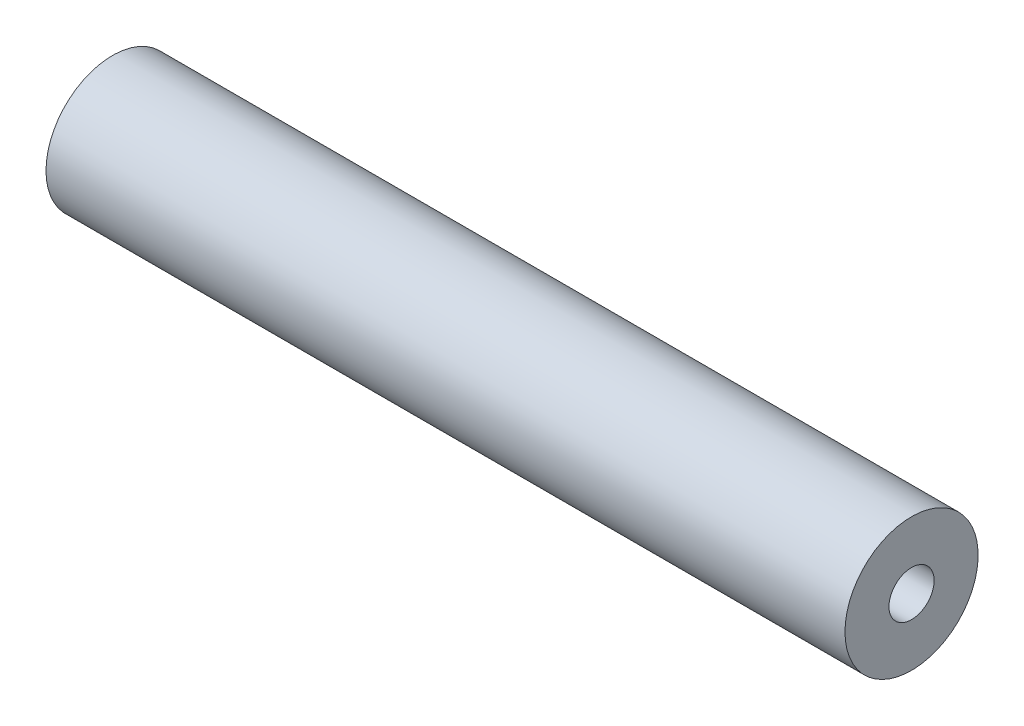
ISO-10303-21;
HEADER;
FILE_DESCRIPTION(('STEP AP214'),'2;1');
FILE_NAME('part.step','',(''),(''),'','','');
FILE_SCHEMA(('AUTOMOTIVE_DESIGN { 1 0 10303 214 1 1 1 1 }'));
ENDSEC;
DATA;
#1=APPLICATION_CONTEXT('core data for automotive mechanical design processes');
#2=APPLICATION_PROTOCOL_DEFINITION('international standard','automotive_design',2000,#1);
#3=PRODUCT_CONTEXT('',#1,'mechanical');
#4=PRODUCT('Part','Part','',(#3));
#5=PRODUCT_RELATED_PRODUCT_CATEGORY('part','',(#4));
#6=PRODUCT_DEFINITION_FORMATION('','',#4);
#7=PRODUCT_DEFINITION_CONTEXT('part definition',#1,'design');
#8=PRODUCT_DEFINITION('design','',#6,#7);
#9=PRODUCT_DEFINITION_SHAPE('','',#8);
#10=(LENGTH_UNIT() NAMED_UNIT(*) SI_UNIT(.MILLI.,.METRE.));
#11=(NAMED_UNIT(*) PLANE_ANGLE_UNIT() SI_UNIT($,.RADIAN.));
#12=(NAMED_UNIT(*) SI_UNIT($,.STERADIAN.) SOLID_ANGLE_UNIT());
#13=UNCERTAINTY_MEASURE_WITH_UNIT(LENGTH_MEASURE(1.E-05),#10,'distance_accuracy_value','');
#14=(GEOMETRIC_REPRESENTATION_CONTEXT(3) GLOBAL_UNCERTAINTY_ASSIGNED_CONTEXT((#13)) GLOBAL_UNIT_ASSIGNED_CONTEXT((#10,
#11,#12)) REPRESENTATION_CONTEXT('',''));
#15=CARTESIAN_POINT('',(0.,0.,0.));
#16=DIRECTION('',(0.,0.,1.));
#17=DIRECTION('',(1.,0.,0.));
#18=AXIS2_PLACEMENT_3D('',#15,#16,#17);
#19=CARTESIAN_POINT('',(76.2,0.,0.));
#20=DIRECTION('',(1.,0.,0.));
#21=DIRECTION('',(0.,0.,-1.));
#22=AXIS2_PLACEMENT_3D('',#19,#20,#21);
#23=PLANE('',#22);
#24=CARTESIAN_POINT('',(76.2,0.,0.));
#25=DIRECTION('',(1.,0.,0.));
#26=DIRECTION('',(0.,0.,-1.));
#27=AXIS2_PLACEMENT_3D('',#24,#25,#26);
#28=CIRCLE('',#27,6.35);
#29=CARTESIAN_POINT('',(76.2,0.,6.35));
#30=VERTEX_POINT('',#29);
#31=EDGE_CURVE('E10',#30,#30,#28,.T.);
#32=ORIENTED_EDGE('',*,*,#31,.T.);
#33=EDGE_LOOP('',(#32));
#34=FACE_BOUND('',#33,.T.);
#35=CARTESIAN_POINT('',(76.2,0.,0.));
#36=DIRECTION('',(1.,0.,0.));
#37=DIRECTION('',(0.,0.,-1.));
#38=AXIS2_PLACEMENT_3D('',#35,#36,#37);
#39=CIRCLE('',#38,2.15265);
#40=CARTESIAN_POINT('',(76.2,0.,2.15265));
#41=VERTEX_POINT('',#40);
#42=EDGE_CURVE('E42',#41,#41,#39,.T.);
#43=ORIENTED_EDGE('',*,*,#42,.F.);
#44=EDGE_LOOP('',(#43));
#45=FACE_BOUND('',#44,.T.);
#46=ADVANCED_FACE('F31',(#34,#45),#23,.T.);
#47=CARTESIAN_POINT('',(0.,0.,0.));
#48=DIRECTION('',(1.,0.,0.));
#49=DIRECTION('',(0.,0.,-1.));
#50=AXIS2_PLACEMENT_3D('',#47,#48,#49);
#51=PLANE('',#50);
#52=CARTESIAN_POINT('',(0.,0.,0.));
#53=DIRECTION('',(1.,0.,0.));
#54=DIRECTION('',(0.,0.,-1.));
#55=AXIS2_PLACEMENT_3D('',#52,#53,#54);
#56=CIRCLE('',#55,6.35);
#57=CARTESIAN_POINT('',(0.,0.,6.35));
#58=VERTEX_POINT('',#57);
#59=EDGE_CURVE('E35',#58,#58,#56,.T.);
#60=ORIENTED_EDGE('',*,*,#59,.F.);
#61=EDGE_LOOP('',(#60));
#62=FACE_BOUND('',#61,.T.);
#63=CARTESIAN_POINT('',(0.,0.,0.));
#64=DIRECTION('',(1.,0.,0.));
#65=DIRECTION('',(0.,0.,-1.));
#66=AXIS2_PLACEMENT_3D('',#63,#64,#65);
#67=CIRCLE('',#66,2.15265);
#68=CARTESIAN_POINT('',(0.,0.,2.15265));
#69=VERTEX_POINT('',#68);
#70=EDGE_CURVE('E44',#69,#69,#67,.T.);
#71=ORIENTED_EDGE('',*,*,#70,.T.);
#72=EDGE_LOOP('',(#71));
#73=FACE_BOUND('',#72,.T.);
#74=ADVANCED_FACE('F54',(#62,#73),#51,.F.);
#75=CARTESIAN_POINT('',(76.2,0.,0.));
#76=DIRECTION('',(-1.,0.,0.));
#77=DIRECTION('',(0.,0.,1.));
#78=AXIS2_PLACEMENT_3D('',#75,#76,#77);
#79=CYLINDRICAL_SURFACE('',#78,6.35);
#80=CARTESIAN_POINT('',(76.2,0.,6.35));
#81=CARTESIAN_POINT('',(75.40625,0.,6.35));
#82=CARTESIAN_POINT('',(74.6125,0.,6.35));
#83=CARTESIAN_POINT('',(73.025,0.,6.35));
#84=CARTESIAN_POINT('',(72.23125,0.,6.35));
#85=CARTESIAN_POINT('',(70.64375,0.,6.35));
#86=CARTESIAN_POINT('',(69.85,0.,6.35));
#87=CARTESIAN_POINT('',(68.2625,0.,6.35));
#88=CARTESIAN_POINT('',(67.46875,0.,6.35));
#89=CARTESIAN_POINT('',(65.88125,0.,6.35));
#90=CARTESIAN_POINT('',(65.0875,0.,6.35));
#91=CARTESIAN_POINT('',(63.5,0.,6.35));
#92=CARTESIAN_POINT('',(62.70625,0.,6.35));
#93=CARTESIAN_POINT('',(61.11875,0.,6.35));
#94=CARTESIAN_POINT('',(60.325,0.,6.35));
#95=CARTESIAN_POINT('',(58.7375,0.,6.35));
#96=CARTESIAN_POINT('',(57.94375,0.,6.35));
#97=CARTESIAN_POINT('',(56.35625,0.,6.35));
#98=CARTESIAN_POINT('',(55.5625,0.,6.35));
#99=CARTESIAN_POINT('',(53.975,0.,6.35));
#100=CARTESIAN_POINT('',(53.18125,0.,6.35));
#101=CARTESIAN_POINT('',(51.59375,0.,6.35));
#102=CARTESIAN_POINT('',(50.8,0.,6.35));
#103=CARTESIAN_POINT('',(49.2125,0.,6.35));
#104=CARTESIAN_POINT('',(48.41875,0.,6.35));
#105=CARTESIAN_POINT('',(46.83125,0.,6.35));
#106=CARTESIAN_POINT('',(46.0375,0.,6.35));
#107=CARTESIAN_POINT('',(44.45,0.,6.35));
#108=CARTESIAN_POINT('',(43.65625,0.,6.35));
#109=CARTESIAN_POINT('',(42.06875,0.,6.35));
#110=CARTESIAN_POINT('',(41.275,0.,6.35));
#111=CARTESIAN_POINT('',(39.6875,0.,6.35));
#112=CARTESIAN_POINT('',(38.89375,0.,6.35));
#113=CARTESIAN_POINT('',(37.30625,0.,6.35));
#114=CARTESIAN_POINT('',(36.5125,0.,6.35));
#115=CARTESIAN_POINT('',(34.925,0.,6.35));
#116=CARTESIAN_POINT('',(34.13125,0.,6.35));
#117=CARTESIAN_POINT('',(32.54375,0.,6.35));
#118=CARTESIAN_POINT('',(31.75,0.,6.35));
#119=CARTESIAN_POINT('',(30.1625,0.,6.35));
#120=CARTESIAN_POINT('',(29.36875,0.,6.35));
#121=CARTESIAN_POINT('',(27.78125,0.,6.35));
#122=CARTESIAN_POINT('',(26.9875,0.,6.35));
#123=CARTESIAN_POINT('',(25.4,0.,6.35));
#124=CARTESIAN_POINT('',(24.60625,0.,6.35));
#125=CARTESIAN_POINT('',(23.01875,0.,6.35));
#126=CARTESIAN_POINT('',(22.225,0.,6.35));
#127=CARTESIAN_POINT('',(20.6375,0.,6.35));
#128=CARTESIAN_POINT('',(19.84375,0.,6.35));
#129=CARTESIAN_POINT('',(18.25625,0.,6.35));
#130=CARTESIAN_POINT('',(17.4625,0.,6.35));
#131=CARTESIAN_POINT('',(15.875,0.,6.35));
#132=CARTESIAN_POINT('',(15.08125,0.,6.35));
#133=CARTESIAN_POINT('',(13.49375,0.,6.35));
#134=CARTESIAN_POINT('',(12.7,0.,6.35));
#135=CARTESIAN_POINT('',(11.1125,0.,6.35));
#136=CARTESIAN_POINT('',(10.31875,0.,6.35));
#137=CARTESIAN_POINT('',(8.73125,0.,6.35));
#138=CARTESIAN_POINT('',(7.93750000000001,0.,6.35));
#139=CARTESIAN_POINT('',(6.35,0.,6.35));
#140=CARTESIAN_POINT('',(5.55625,0.,6.35));
#141=CARTESIAN_POINT('',(3.96875,0.,6.35));
#142=CARTESIAN_POINT('',(3.175,0.,6.35));
#143=CARTESIAN_POINT('',(1.5875,0.,6.35));
#144=CARTESIAN_POINT('',(0.793750000000001,0.,6.35));
#145=CARTESIAN_POINT('',(0.,0.,6.35));
#146=B_SPLINE_CURVE_WITH_KNOTS('',3,(#80,#81,#82,#83,#84,#85,#86,#87,#88,#89,#90,#91,#92,#93,
#94,#95,#96,#97,#98,#99,#100,#101,#102,#103,#104,#105,#106,#107,#108,#109,#110,#111,#112,#113,
#114,#115,#116,#117,#118,#119,#120,#121,#122,#123,#124,#125,#126,#127,#128,#129,#130,#131,#132,
#133,#134,#135,#136,#137,#138,#139,#140,#141,#142,#143,#144,#145),.UNSPECIFIED.,.F.,.F.,(4,2,2,
2,2,2,2,2,2,2,2,2,2,2,2,2,2,2,2,2,2,2,2,2,2,2,2,2,2,2,2,2,4),(0.,2.38124999999999,
4.76249999999999,7.14374999999999,9.52499999999999,11.90625,14.2875,16.66875,19.05,21.43125,
23.8125,26.19375,28.575,30.95625,33.3375,35.71875,38.1,40.48125,42.8625,45.24375,47.625,
50.00625,52.3875,54.76875,57.15,59.53125,61.9125,64.29375,66.675,69.05625,71.4375,73.81875,
76.2),.UNSPECIFIED.);
#147=EDGE_CURVE('BSEAM33',#30,#58,#146,.T.);
#148=ORIENTED_EDGE('',*,*,#31,.F.);
#149=ORIENTED_EDGE('',*,*,#59,.T.);
#150=ORIENTED_EDGE('',*,*,#147,.T.);
#151=ORIENTED_EDGE('',*,*,#147,.F.);
#152=EDGE_LOOP('',(#148,#150,#149,#151));
#153=FACE_BOUND('',#152,.T.);
#154=ADVANCED_FACE('F33',(#153),#79,.T.);
#155=CARTESIAN_POINT('',(76.2,0.,0.));
#156=DIRECTION('',(-1.,0.,0.));
#157=DIRECTION('',(0.,0.,1.));
#158=AXIS2_PLACEMENT_3D('',#155,#156,#157);
#159=CYLINDRICAL_SURFACE('',#158,2.15265);
#160=CARTESIAN_POINT('',(76.2,0.,2.15265));
#161=CARTESIAN_POINT('',(75.40625,0.,2.15265));
#162=CARTESIAN_POINT('',(74.6125,0.,2.15265));
#163=CARTESIAN_POINT('',(73.025,0.,2.15265));
#164=CARTESIAN_POINT('',(72.23125,0.,2.15265));
#165=CARTESIAN_POINT('',(70.64375,0.,2.15265));
#166=CARTESIAN_POINT('',(69.85,0.,2.15265));
#167=CARTESIAN_POINT('',(68.2625,0.,2.15265));
#168=CARTESIAN_POINT('',(67.46875,0.,2.15265));
#169=CARTESIAN_POINT('',(65.88125,0.,2.15265));
#170=CARTESIAN_POINT('',(65.0875,0.,2.15265));
#171=CARTESIAN_POINT('',(63.5,0.,2.15265));
#172=CARTESIAN_POINT('',(62.70625,0.,2.15265));
#173=CARTESIAN_POINT('',(61.11875,0.,2.15265));
#174=CARTESIAN_POINT('',(60.325,0.,2.15265));
#175=CARTESIAN_POINT('',(58.7375,0.,2.15265));
#176=CARTESIAN_POINT('',(57.94375,0.,2.15265));
#177=CARTESIAN_POINT('',(56.35625,0.,2.15265));
#178=CARTESIAN_POINT('',(55.5625,0.,2.15265));
#179=CARTESIAN_POINT('',(53.975,0.,2.15265));
#180=CARTESIAN_POINT('',(53.18125,0.,2.15265));
#181=CARTESIAN_POINT('',(51.59375,0.,2.15265));
#182=CARTESIAN_POINT('',(50.8,0.,2.15265));
#183=CARTESIAN_POINT('',(49.2125,0.,2.15265));
#184=CARTESIAN_POINT('',(48.41875,0.,2.15265));
#185=CARTESIAN_POINT('',(46.83125,0.,2.15265));
#186=CARTESIAN_POINT('',(46.0375,0.,2.15265));
#187=CARTESIAN_POINT('',(44.45,0.,2.15265));
#188=CARTESIAN_POINT('',(43.65625,0.,2.15265));
#189=CARTESIAN_POINT('',(42.06875,0.,2.15265));
#190=CARTESIAN_POINT('',(41.275,0.,2.15265));
#191=CARTESIAN_POINT('',(39.6875,0.,2.15265));
#192=CARTESIAN_POINT('',(38.89375,0.,2.15265));
#193=CARTESIAN_POINT('',(37.30625,0.,2.15265));
#194=CARTESIAN_POINT('',(36.5125,0.,2.15265));
#195=CARTESIAN_POINT('',(34.925,0.,2.15265));
#196=CARTESIAN_POINT('',(34.13125,0.,2.15265));
#197=CARTESIAN_POINT('',(32.54375,0.,2.15265));
#198=CARTESIAN_POINT('',(31.75,0.,2.15265));
#199=CARTESIAN_POINT('',(30.1625,0.,2.15265));
#200=CARTESIAN_POINT('',(29.36875,0.,2.15265));
#201=CARTESIAN_POINT('',(27.78125,0.,2.15265));
#202=CARTESIAN_POINT('',(26.9875,0.,2.15265));
#203=CARTESIAN_POINT('',(25.4,0.,2.15265));
#204=CARTESIAN_POINT('',(24.60625,0.,2.15265));
#205=CARTESIAN_POINT('',(23.01875,0.,2.15265));
#206=CARTESIAN_POINT('',(22.225,0.,2.15265));
#207=CARTESIAN_POINT('',(20.6375,0.,2.15265));
#208=CARTESIAN_POINT('',(19.84375,0.,2.15265));
#209=CARTESIAN_POINT('',(18.25625,0.,2.15265));
#210=CARTESIAN_POINT('',(17.4625,0.,2.15265));
#211=CARTESIAN_POINT('',(15.875,0.,2.15265));
#212=CARTESIAN_POINT('',(15.08125,0.,2.15265));
#213=CARTESIAN_POINT('',(13.49375,0.,2.15265));
#214=CARTESIAN_POINT('',(12.7,0.,2.15265));
#215=CARTESIAN_POINT('',(11.1125,0.,2.15265));
#216=CARTESIAN_POINT('',(10.31875,0.,2.15265));
#217=CARTESIAN_POINT('',(8.73125,0.,2.15265));
#218=CARTESIAN_POINT('',(7.93750000000001,0.,2.15265));
#219=CARTESIAN_POINT('',(6.35,0.,2.15265));
#220=CARTESIAN_POINT('',(5.55625,0.,2.15265));
#221=CARTESIAN_POINT('',(3.96875,0.,2.15265));
#222=CARTESIAN_POINT('',(3.175,0.,2.15265));
#223=CARTESIAN_POINT('',(1.5875,0.,2.15265));
#224=CARTESIAN_POINT('',(0.793750000000001,0.,2.15265));
#225=CARTESIAN_POINT('',(0.,0.,2.15265));
#226=B_SPLINE_CURVE_WITH_KNOTS('',3,(#160,#161,#162,#163,#164,#165,#166,#167,#168,#169,#170,
#171,#172,#173,#174,#175,#176,#177,#178,#179,#180,#181,#182,#183,#184,#185,#186,#187,#188,#189,
#190,#191,#192,#193,#194,#195,#196,#197,#198,#199,#200,#201,#202,#203,#204,#205,#206,#207,#208,
#209,#210,#211,#212,#213,#214,#215,#216,#217,#218,#219,#220,#221,#222,#223,#224,#225),
.UNSPECIFIED.,.F.,.F.,(4,2,2,2,2,2,2,2,2,2,2,2,2,2,2,2,2,2,2,2,2,2,2,2,2,2,2,2,2,2,2,2,4),(0.,
2.38124999999999,4.76249999999999,7.14374999999999,9.52499999999999,11.90625,14.2875,16.66875,
19.05,21.43125,23.8125,26.19375,28.575,30.95625,33.3375,35.71875,38.1,40.48125,42.8625,45.24375,
47.625,50.00625,52.3875,54.76875,57.15,59.53125,61.9125,64.29375,66.675,69.05625,71.4375,
73.81875,76.2),.UNSPECIFIED.);
#227=EDGE_CURVE('BSEAM50',#41,#69,#226,.T.);
#228=ORIENTED_EDGE('',*,*,#42,.T.);
#229=ORIENTED_EDGE('',*,*,#70,.F.);
#230=ORIENTED_EDGE('',*,*,#227,.T.);
#231=ORIENTED_EDGE('',*,*,#227,.F.);
#232=EDGE_LOOP('',(#228,#230,#229,#231));
#233=FACE_BOUND('',#232,.T.);
#234=ADVANCED_FACE('F50',(#233),#159,.F.);
#235=CLOSED_SHELL('',(#46,#74,#154,#234));
#236=MANIFOLD_SOLID_BREP('B2',#235);
#237=ADVANCED_BREP_SHAPE_REPRESENTATION('',(#18,#236),#14);
#238=SHAPE_DEFINITION_REPRESENTATION(#9,#237);
ENDSEC;
END-ISO-10303-21;
